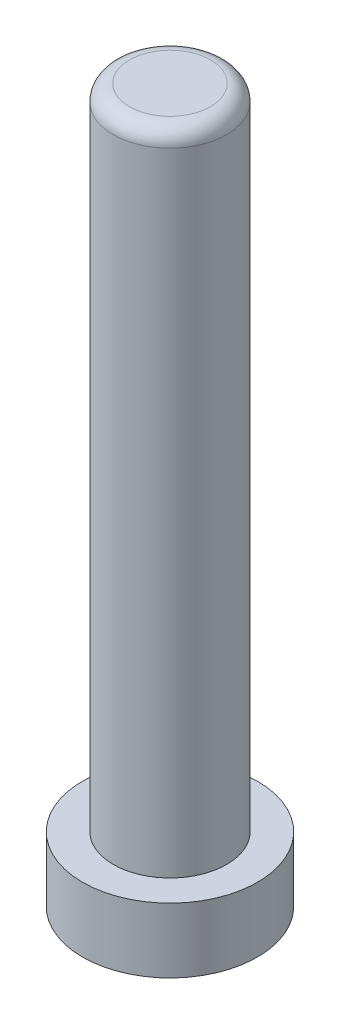
ISO-10303-21;
HEADER;
FILE_DESCRIPTION(('STEP AP214'),'2;1');
FILE_NAME('part.step','',(''),(''),'','','');
FILE_SCHEMA(('AUTOMOTIVE_DESIGN { 1 0 10303 214 1 1 1 1 }'));
ENDSEC;
DATA;
#1=APPLICATION_CONTEXT('core data for automotive mechanical design processes');
#2=APPLICATION_PROTOCOL_DEFINITION('international standard','automotive_design',2000,#1);
#3=PRODUCT_CONTEXT('',#1,'mechanical');
#4=PRODUCT('Part','Part','',(#3));
#5=PRODUCT_RELATED_PRODUCT_CATEGORY('part','',(#4));
#6=PRODUCT_DEFINITION_FORMATION('','',#4);
#7=PRODUCT_DEFINITION_CONTEXT('part definition',#1,'design');
#8=PRODUCT_DEFINITION('design','',#6,#7);
#9=PRODUCT_DEFINITION_SHAPE('','',#8);
#10=(LENGTH_UNIT() NAMED_UNIT(*) SI_UNIT(.MILLI.,.METRE.));
#11=(NAMED_UNIT(*) PLANE_ANGLE_UNIT() SI_UNIT($,.RADIAN.));
#12=(NAMED_UNIT(*) SI_UNIT($,.STERADIAN.) SOLID_ANGLE_UNIT());
#13=UNCERTAINTY_MEASURE_WITH_UNIT(LENGTH_MEASURE(1.E-05),#10,'distance_accuracy_value','');
#14=(GEOMETRIC_REPRESENTATION_CONTEXT(3) GLOBAL_UNCERTAINTY_ASSIGNED_CONTEXT((#13)) GLOBAL_UNIT_ASSIGNED_CONTEXT((#10,
#11,#12)) REPRESENTATION_CONTEXT('',''));
#15=CARTESIAN_POINT('',(0.,0.,0.));
#16=DIRECTION('',(0.,0.,1.));
#17=DIRECTION('',(1.,0.,0.));
#18=AXIS2_PLACEMENT_3D('',#15,#16,#17);
#19=CARTESIAN_POINT('',(0.,2.,0.));
#20=DIRECTION('',(0.,-1.,0.));
#21=DIRECTION('',(0.,0.,-1.));
#22=AXIS2_PLACEMENT_3D('',#19,#20,#21);
#23=CYLINDRICAL_SURFACE('',#22,2.7);
#24=CARTESIAN_POINT('',(0.,2.,0.));
#25=DIRECTION('',(0.,1.,0.));
#26=DIRECTION('',(0.,0.,1.));
#27=AXIS2_PLACEMENT_3D('',#24,#25,#26);
#28=CIRCLE('',#27,2.7);
#29=CARTESIAN_POINT('',(0.,2.,2.7));
#30=VERTEX_POINT('',#29);
#31=EDGE_CURVE('E51',#30,#30,#28,.T.);
#32=ORIENTED_EDGE('',*,*,#31,.F.);
#33=EDGE_LOOP('',(#32));
#34=FACE_BOUND('',#33,.T.);
#35=CARTESIAN_POINT('',(0.,0.,0.));
#36=DIRECTION('',(0.,1.,0.));
#37=DIRECTION('',(0.,0.,1.));
#38=AXIS2_PLACEMENT_3D('',#35,#36,#37);
#39=CIRCLE('',#38,2.7);
#40=CARTESIAN_POINT('',(0.,0.,2.7));
#41=VERTEX_POINT('',#40);
#42=EDGE_CURVE('E54',#41,#41,#39,.T.);
#43=ORIENTED_EDGE('',*,*,#42,.T.);
#44=EDGE_LOOP('',(#43));
#45=FACE_BOUND('',#44,.T.);
#46=ADVANCED_FACE('F37',(#34,#45),#23,.T.);
#47=CARTESIAN_POINT('',(0.,2.,0.));
#48=DIRECTION('',(0.,1.,0.));
#49=DIRECTION('',(0.,0.,1.));
#50=AXIS2_PLACEMENT_3D('',#47,#48,#49);
#51=PLANE('',#50);
#52=CARTESIAN_POINT('',(0.,2.,0.));
#53=DIRECTION('',(0.,1.,0.));
#54=DIRECTION('',(0.,0.,1.));
#55=AXIS2_PLACEMENT_3D('',#52,#53,#54);
#56=CIRCLE('',#55,1.75);
#57=CARTESIAN_POINT('',(0.,2.,1.75));
#58=VERTEX_POINT('',#57);
#59=EDGE_CURVE('E69',#58,#58,#56,.T.);
#60=ORIENTED_EDGE('',*,*,#59,.F.);
#61=EDGE_LOOP('',(#60));
#62=FACE_BOUND('',#61,.T.);
#63=ORIENTED_EDGE('',*,*,#31,.T.);
#64=EDGE_LOOP('',(#63));
#65=FACE_BOUND('',#64,.T.);
#66=ADVANCED_FACE('F99',(#62,#65),#51,.T.);
#67=CARTESIAN_POINT('',(0.,0.,0.));
#68=DIRECTION('',(0.,1.,0.));
#69=DIRECTION('',(0.,0.,1.));
#70=AXIS2_PLACEMENT_3D('',#67,#68,#69);
#71=PLANE('',#70);
#72=CARTESIAN_POINT('',(0.,0.,0.));
#73=DIRECTION('',(0.,-1.,0.));
#74=DIRECTION('',(0.,0.,-1.));
#75=AXIS2_PLACEMENT_3D('',#72,#73,#74);
#76=CIRCLE('',#75,1.2);
#77=CARTESIAN_POINT('',(0.,0.,-1.2));
#78=VERTEX_POINT('',#77);
#79=EDGE_CURVE('E58',#78,#78,#76,.T.);
#80=ORIENTED_EDGE('',*,*,#79,.F.);
#81=EDGE_LOOP('',(#80));
#82=FACE_BOUND('',#81,.T.);
#83=ORIENTED_EDGE('',*,*,#42,.F.);
#84=EDGE_LOOP('',(#83));
#85=FACE_BOUND('',#84,.T.);
#86=ADVANCED_FACE('F104',(#82,#85),#71,.F.);
#87=CARTESIAN_POINT('',(0.,2.8,0.));
#88=DIRECTION('',(0.,-1.,0.));
#89=DIRECTION('',(0.,0.,-1.));
#90=AXIS2_PLACEMENT_3D('',#87,#88,#89);
#91=CYLINDRICAL_SURFACE('',#90,1.2);
#92=CARTESIAN_POINT('',(0.,2.,0.));
#93=DIRECTION('',(0.,1.,0.));
#94=DIRECTION('',(0.,0.,1.));
#95=AXIS2_PLACEMENT_3D('',#92,#93,#94);
#96=CIRCLE('',#95,1.2);
#97=CARTESIAN_POINT('',(0.,2.,1.2));
#98=VERTEX_POINT('',#97);
#99=EDGE_CURVE('E65',#98,#98,#96,.F.);
#100=ORIENTED_EDGE('',*,*,#99,.F.);
#101=EDGE_LOOP('',(#100));
#102=FACE_BOUND('',#101,.T.);
#103=ORIENTED_EDGE('',*,*,#79,.T.);
#104=EDGE_LOOP('',(#103));
#105=FACE_BOUND('',#104,.T.);
#106=ADVANCED_FACE('F111',(#102,#105),#91,.F.);
#107=CARTESIAN_POINT('',(0.,2.,0.));
#108=DIRECTION('',(0.,1.,0.));
#109=DIRECTION('',(0.,0.,1.));
#110=AXIS2_PLACEMENT_3D('',#107,#108,#109);
#111=PLANE('',#110);
#112=CARTESIAN_POINT('',(0.,2.,0.));
#113=DIRECTION('',(0.,1.,0.));
#114=DIRECTION('',(0.,0.,1.));
#115=AXIS2_PLACEMENT_3D('',#112,#113,#114);
#116=CIRCLE('',#115,0.95);
#117=CARTESIAN_POINT('',(0.,2.,0.95));
#118=VERTEX_POINT('',#117);
#119=EDGE_CURVE('E41',#118,#118,#116,.T.);
#120=ORIENTED_EDGE('',*,*,#119,.T.);
#121=EDGE_LOOP('',(#120));
#122=FACE_BOUND('',#121,.T.);
#123=ORIENTED_EDGE('',*,*,#99,.T.);
#124=EDGE_LOOP('',(#123));
#125=FACE_BOUND('',#124,.T.);
#126=ADVANCED_FACE('F82',(#122,#125),#111,.F.);
#127=CARTESIAN_POINT('',(0.,22.,0.));
#128=DIRECTION('',(0.,-1.,0.));
#129=DIRECTION('',(0.,0.,-1.));
#130=AXIS2_PLACEMENT_3D('',#127,#128,#129);
#131=CYLINDRICAL_SURFACE('',#130,1.75);
#132=CARTESIAN_POINT('',(0.,21.5,0.));
#133=DIRECTION('',(0.,1.,0.));
#134=DIRECTION('',(0.,0.,1.));
#135=AXIS2_PLACEMENT_3D('',#132,#133,#134);
#136=CIRCLE('',#135,1.75);
#137=CARTESIAN_POINT('',(0.,21.5,1.75));
#138=VERTEX_POINT('',#137);
#139=EDGE_CURVE('E10',#138,#138,#136,.F.);
#140=ORIENTED_EDGE('',*,*,#139,.T.);
#141=EDGE_LOOP('',(#140));
#142=FACE_BOUND('',#141,.T.);
#143=ORIENTED_EDGE('',*,*,#59,.T.);
#144=EDGE_LOOP('',(#143));
#145=FACE_BOUND('',#144,.T.);
#146=ADVANCED_FACE('F117',(#142,#145),#131,.T.);
#147=CARTESIAN_POINT('',(0.,22.,0.));
#148=DIRECTION('',(0.,1.,0.));
#149=DIRECTION('',(0.,0.,1.));
#150=AXIS2_PLACEMENT_3D('',#147,#148,#149);
#151=PLANE('',#150);
#152=CARTESIAN_POINT('',(0.,22.,0.));
#153=DIRECTION('',(0.,1.,0.));
#154=DIRECTION('',(0.,0.,1.));
#155=AXIS2_PLACEMENT_3D('',#152,#153,#154);
#156=CIRCLE('',#155,1.25);
#157=CARTESIAN_POINT('',(0.,22.,1.25));
#158=VERTEX_POINT('',#157);
#159=EDGE_CURVE('E46',#158,#158,#156,.T.);
#160=ORIENTED_EDGE('',*,*,#159,.T.);
#161=EDGE_LOOP('',(#160));
#162=FACE_BOUND('',#161,.T.);
#163=ADVANCED_FACE('F95',(#162),#151,.T.);
#164=CARTESIAN_POINT('',(0.,21.5,0.));
#165=DIRECTION('',(0.,1.,0.));
#166=DIRECTION('',(0.,0.,1.));
#167=AXIS2_PLACEMENT_3D('',#164,#165,#166);
#168=TOROIDAL_SURFACE('',#167,1.25,0.5);
#169=ORIENTED_EDGE('',*,*,#139,.F.);
#170=EDGE_LOOP('',(#169));
#171=FACE_BOUND('',#170,.T.);
#172=ORIENTED_EDGE('',*,*,#159,.F.);
#173=EDGE_LOOP('',(#172));
#174=FACE_BOUND('',#173,.T.);
#175=ADVANCED_FACE('F39',(#171,#174),#168,.T.);
#176=CARTESIAN_POINT('',(0.,9.5,0.));
#177=DIRECTION('',(0.,-1.,0.));
#178=DIRECTION('',(0.,0.,-1.));
#179=AXIS2_PLACEMENT_3D('',#176,#177,#178);
#180=CYLINDRICAL_SURFACE('',#179,0.95);
#181=CARTESIAN_POINT('',(0.,9.5,0.));
#182=DIRECTION('',(0.,-1.,0.));
#183=DIRECTION('',(0.,0.,-1.));
#184=AXIS2_PLACEMENT_3D('',#181,#182,#183);
#185=CIRCLE('',#184,0.95);
#186=CARTESIAN_POINT('',(0.,9.5,-0.95));
#187=VERTEX_POINT('',#186);
#188=EDGE_CURVE('E73',#187,#187,#185,.T.);
#189=ORIENTED_EDGE('',*,*,#188,.F.);
#190=EDGE_LOOP('',(#189));
#191=FACE_BOUND('',#190,.T.);
#192=ORIENTED_EDGE('',*,*,#119,.F.);
#193=EDGE_LOOP('',(#192));
#194=FACE_BOUND('',#193,.T.);
#195=ADVANCED_FACE('F85',(#191,#194),#180,.F.);
#196=CARTESIAN_POINT('',(0.,9.5,0.));
#197=DIRECTION('',(0.,-1.,0.));
#198=DIRECTION('',(0.,0.,-1.));
#199=AXIS2_PLACEMENT_3D('',#196,#197,#198);
#200=PLANE('',#199);
#201=ORIENTED_EDGE('',*,*,#188,.T.);
#202=EDGE_LOOP('',(#201));
#203=FACE_BOUND('',#202,.T.);
#204=ADVANCED_FACE('F87',(#203),#200,.T.);
#205=CLOSED_SHELL('',(#46,#66,#86,#106,#126,#146,#163,#175,#195,#204));
#206=MANIFOLD_SOLID_BREP('B2',#205);
#207=ADVANCED_BREP_SHAPE_REPRESENTATION('',(#18,#206),#14);
#208=SHAPE_DEFINITION_REPRESENTATION(#9,#207);
ENDSEC;
END-ISO-10303-21;
